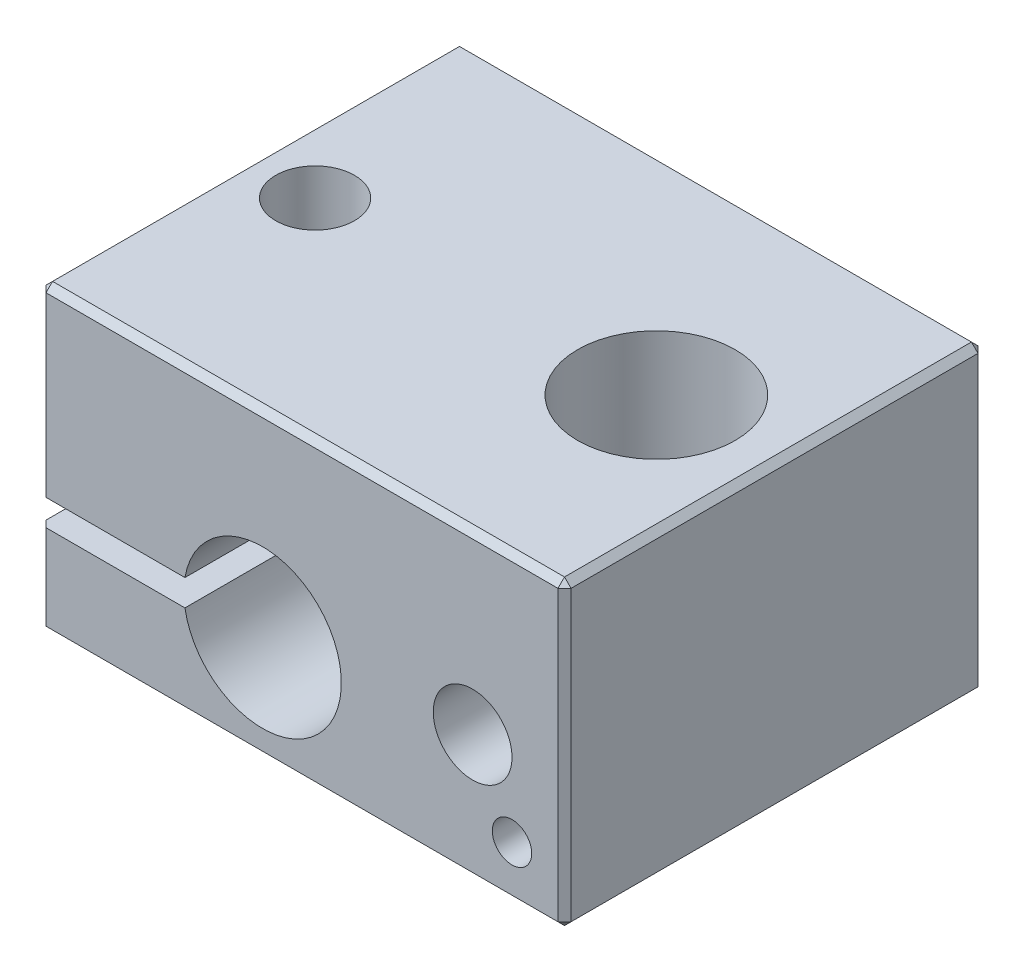
ISO-10303-21;
HEADER;
FILE_DESCRIPTION(('STEP AP214'),'2;1');
FILE_NAME('part.step','',(''),(''),'','','');
FILE_SCHEMA(('AUTOMOTIVE_DESIGN { 1 0 10303 214 1 1 1 1 }'));
ENDSEC;
DATA;
#1=APPLICATION_CONTEXT('core data for automotive mechanical design processes');
#2=APPLICATION_PROTOCOL_DEFINITION('international standard','automotive_design',2000,#1);
#3=PRODUCT_CONTEXT('',#1,'mechanical');
#4=PRODUCT('Part','Part','',(#3));
#5=PRODUCT_RELATED_PRODUCT_CATEGORY('part','',(#4));
#6=PRODUCT_DEFINITION_FORMATION('','',#4);
#7=PRODUCT_DEFINITION_CONTEXT('part definition',#1,'design');
#8=PRODUCT_DEFINITION('design','',#6,#7);
#9=PRODUCT_DEFINITION_SHAPE('','',#8);
#10=(LENGTH_UNIT() NAMED_UNIT(*) SI_UNIT(.MILLI.,.METRE.));
#11=(NAMED_UNIT(*) PLANE_ANGLE_UNIT() SI_UNIT($,.RADIAN.));
#12=(NAMED_UNIT(*) SI_UNIT($,.STERADIAN.) SOLID_ANGLE_UNIT());
#13=UNCERTAINTY_MEASURE_WITH_UNIT(LENGTH_MEASURE(1.E-05),#10,'distance_accuracy_value','');
#14=(GEOMETRIC_REPRESENTATION_CONTEXT(3) GLOBAL_UNCERTAINTY_ASSIGNED_CONTEXT((#13)) GLOBAL_UNIT_ASSIGNED_CONTEXT((#10,
#11,#12)) REPRESENTATION_CONTEXT('',''));
#15=CARTESIAN_POINT('',(0.,0.,0.));
#16=DIRECTION('',(0.,0.,1.));
#17=DIRECTION('',(1.,0.,0.));
#18=AXIS2_PLACEMENT_3D('',#15,#16,#17);
#19=CARTESIAN_POINT('',(-9.99999999999999,11.5,7.99999999999999));
#20=DIRECTION('',(-1.,0.,0.));
#21=DIRECTION('',(0.,0.,1.));
#22=AXIS2_PLACEMENT_3D('',#19,#20,#21);
#23=PLANE('',#22);
#24=DIRECTION('',(0.,0.,-1.));
#25=VECTOR('',#24,1.);
#26=CARTESIAN_POINT('',(-10.,3.5,7.99999999999999));
#27=LINE('',#26,#25);
#28=CARTESIAN_POINT('',(-10.,3.5,7.74999999999999));
#29=VERTEX_POINT('',#28);
#30=CARTESIAN_POINT('',(-10.,3.5,-7.75000000000001));
#31=VERTEX_POINT('',#30);
#32=EDGE_CURVE('E192',#29,#31,#27,.T.);
#33=ORIENTED_EDGE('',*,*,#32,.T.);
#34=DIRECTION('',(0.,-1.,0.));
#35=VECTOR('',#34,1.);
#36=CARTESIAN_POINT('',(-10.,11.5,-7.75000000000001));
#37=LINE('',#36,#35);
#38=CARTESIAN_POINT('',(-10.,0.250000000000004,-7.75000000000001));
#39=VERTEX_POINT('',#38);
#40=EDGE_CURVE('E208',#31,#39,#37,.T.);
#41=ORIENTED_EDGE('',*,*,#40,.T.);
#42=DIRECTION('',(0.,0.,1.));
#43=VECTOR('',#42,1.);
#44=CARTESIAN_POINT('',(-9.99999999999999,0.250000000000004,7.99999999999999));
#45=LINE('',#44,#43);
#46=CARTESIAN_POINT('',(-9.99999999999999,0.250000000000004,7.74999999999999));
#47=VERTEX_POINT('',#46);
#48=EDGE_CURVE('E206',#39,#47,#45,.T.);
#49=ORIENTED_EDGE('',*,*,#48,.T.);
#50=DIRECTION('',(0.,1.,0.));
#51=VECTOR('',#50,1.);
#52=CARTESIAN_POINT('',(-9.99999999999999,11.5,7.74999999999999));
#53=LINE('',#52,#51);
#54=EDGE_CURVE('E173',#47,#29,#53,.T.);
#55=ORIENTED_EDGE('',*,*,#54,.T.);
#56=EDGE_LOOP('',(#33,#41,#49,#55));
#57=FACE_BOUND('',#56,.T.);
#58=ADVANCED_FACE('F34',(#57),#23,.T.);
#59=CARTESIAN_POINT('',(-10.,11.5,-8.00000000000001));
#60=DIRECTION('',(0.,0.,-1.));
#61=DIRECTION('',(-1.,0.,0.));
#62=AXIS2_PLACEMENT_3D('',#59,#60,#61);
#63=PLANE('',#62);
#64=DIRECTION('',(-1.,0.,0.));
#65=VECTOR('',#64,1.);
#66=CARTESIAN_POINT('',(-10.,0.250000000000004,-8.00000000000001));
#67=LINE('',#66,#65);
#68=CARTESIAN_POINT('',(9.75,0.250000000000004,-8.00000000000001));
#69=VERTEX_POINT('',#68);
#70=CARTESIAN_POINT('',(-9.74999999999999,0.250000000000004,-8.00000000000001));
#71=VERTEX_POINT('',#70);
#72=EDGE_CURVE('E217',#69,#71,#67,.T.);
#73=ORIENTED_EDGE('',*,*,#72,.T.);
#74=DIRECTION('',(0.,1.,0.));
#75=VECTOR('',#74,1.);
#76=CARTESIAN_POINT('',(-9.74999999999999,11.5,-8.00000000000001));
#77=LINE('',#76,#75);
#78=CARTESIAN_POINT('',(-9.74999999999999,3.5,-8.00000000000001));
#79=VERTEX_POINT('',#78);
#80=EDGE_CURVE('E219',#71,#79,#77,.T.);
#81=ORIENTED_EDGE('',*,*,#80,.T.);
#82=DIRECTION('',(-1.,0.,0.));
#83=VECTOR('',#82,1.);
#84=CARTESIAN_POINT('',(-4.4580398915498,3.5,-8.00000000000001));
#85=LINE('',#84,#83);
#86=CARTESIAN_POINT('',(-4.4580398915498,3.5,-8.00000000000001));
#87=VERTEX_POINT('',#86);
#88=EDGE_CURVE('E194',#87,#79,#85,.T.);
#89=ORIENTED_EDGE('',*,*,#88,.F.);
#90=CARTESIAN_POINT('',(-1.49999999999999,4.,-8.00000000000001));
#91=DIRECTION('',(0.,0.,1.));
#92=DIRECTION('',(1.,0.,0.));
#93=AXIS2_PLACEMENT_3D('',#90,#91,#92);
#94=CIRCLE('',#93,3.);
#95=CARTESIAN_POINT('',(-4.4580398915498,4.5,-8.00000000000001));
#96=VERTEX_POINT('',#95);
#97=EDGE_CURVE('E168',#87,#96,#94,.T.);
#98=ORIENTED_EDGE('',*,*,#97,.T.);
#99=DIRECTION('',(1.,0.,0.));
#100=VECTOR('',#99,1.);
#101=CARTESIAN_POINT('',(-10.,4.5,-8.00000000000001));
#102=LINE('',#101,#100);
#103=CARTESIAN_POINT('',(-9.74999999999999,4.5,-8.00000000000001));
#104=VERTEX_POINT('',#103);
#105=EDGE_CURVE('E190',#104,#96,#102,.T.);
#106=ORIENTED_EDGE('',*,*,#105,.F.);
#107=DIRECTION('',(0.,1.,0.));
#108=VECTOR('',#107,1.);
#109=CARTESIAN_POINT('',(-9.74999999999999,11.5,-8.00000000000001));
#110=LINE('',#109,#108);
#111=CARTESIAN_POINT('',(-9.74999999999999,11.25,-8.00000000000001));
#112=VERTEX_POINT('',#111);
#113=EDGE_CURVE('E215',#104,#112,#110,.T.);
#114=ORIENTED_EDGE('',*,*,#113,.T.);
#115=DIRECTION('',(1.,0.,0.));
#116=VECTOR('',#115,1.);
#117=CARTESIAN_POINT('',(10.,11.25,-8.00000000000001));
#118=LINE('',#117,#116);
#119=CARTESIAN_POINT('',(9.75,11.25,-8.00000000000001));
#120=VERTEX_POINT('',#119);
#121=EDGE_CURVE('E211',#112,#120,#118,.T.);
#122=ORIENTED_EDGE('',*,*,#121,.T.);
#123=DIRECTION('',(0.,-1.,0.));
#124=VECTOR('',#123,1.);
#125=CARTESIAN_POINT('',(9.75,11.5,-8.00000000000001));
#126=LINE('',#125,#124);
#127=EDGE_CURVE('E213',#120,#69,#126,.T.);
#128=ORIENTED_EDGE('',*,*,#127,.T.);
#129=EDGE_LOOP('',(#73,#81,#89,#98,#106,#114,#122,#128));
#130=FACE_BOUND('',#129,.T.);
#131=ADVANCED_FACE('F394',(#130),#63,.T.);
#132=DIRECTION('',(0.,0.,-1.));
#133=VECTOR('',#132,1.);
#134=CARTESIAN_POINT('',(-10.,11.25,-8.00000000000001));
#135=LINE('',#134,#133);
#136=CARTESIAN_POINT('',(-9.99999999999999,11.25,7.74999999999999));
#137=VERTEX_POINT('',#136);
#138=CARTESIAN_POINT('',(-10.,11.25,-7.75000000000001));
#139=VERTEX_POINT('',#138);
#140=EDGE_CURVE('E254',#137,#139,#135,.T.);
#141=ORIENTED_EDGE('',*,*,#140,.T.);
#142=DIRECTION('',(0.,-1.,0.));
#143=VECTOR('',#142,1.);
#144=CARTESIAN_POINT('',(-10.,11.5,-7.75000000000001));
#145=LINE('',#144,#143);
#146=CARTESIAN_POINT('',(-10.,4.5,-7.75000000000001));
#147=VERTEX_POINT('',#146);
#148=EDGE_CURVE('E256',#139,#147,#145,.T.);
#149=ORIENTED_EDGE('',*,*,#148,.T.);
#150=DIRECTION('',(0.,0.,-1.));
#151=VECTOR('',#150,1.);
#152=CARTESIAN_POINT('',(-10.,4.5,7.99999999999999));
#153=LINE('',#152,#151);
#154=CARTESIAN_POINT('',(-10.,4.5,7.74999999999999));
#155=VERTEX_POINT('',#154);
#156=EDGE_CURVE('E200',#155,#147,#153,.T.);
#157=ORIENTED_EDGE('',*,*,#156,.F.);
#158=DIRECTION('',(0.,1.,0.));
#159=VECTOR('',#158,1.);
#160=CARTESIAN_POINT('',(-9.99999999999999,11.5,7.74999999999999));
#161=LINE('',#160,#159);
#162=EDGE_CURVE('E252',#155,#137,#161,.T.);
#163=ORIENTED_EDGE('',*,*,#162,.T.);
#164=EDGE_LOOP('',(#141,#149,#157,#163));
#165=FACE_BOUND('',#164,.T.);
#166=ADVANCED_FACE('F399',(#165),#23,.T.);
#167=CARTESIAN_POINT('',(10.,11.5,7.99999999999999));
#168=DIRECTION('',(0.,0.,1.));
#169=DIRECTION('',(1.,0.,0.));
#170=AXIS2_PLACEMENT_3D('',#167,#168,#169);
#171=PLANE('',#170);
#172=DIRECTION('',(-1.,0.,0.));
#173=VECTOR('',#172,1.);
#174=CARTESIAN_POINT('',(-4.4580398915498,3.5,7.99999999999999));
#175=LINE('',#174,#173);
#176=CARTESIAN_POINT('',(-4.4580398915498,3.5,7.99999999999999));
#177=VERTEX_POINT('',#176);
#178=CARTESIAN_POINT('',(-9.74999999999999,3.5,7.99999999999999));
#179=VERTEX_POINT('',#178);
#180=EDGE_CURVE('E180',#177,#179,#175,.T.);
#181=ORIENTED_EDGE('',*,*,#180,.T.);
#182=DIRECTION('',(0.,-1.,0.));
#183=VECTOR('',#182,1.);
#184=CARTESIAN_POINT('',(-9.75,11.5,7.99999999999999));
#185=LINE('',#184,#183);
#186=CARTESIAN_POINT('',(-9.75,0.250000000000004,7.99999999999999));
#187=VERTEX_POINT('',#186);
#188=EDGE_CURVE('E241',#179,#187,#185,.T.);
#189=ORIENTED_EDGE('',*,*,#188,.T.);
#190=DIRECTION('',(1.,0.,0.));
#191=VECTOR('',#190,1.);
#192=CARTESIAN_POINT('',(10.,0.250000000000004,7.99999999999999));
#193=LINE('',#192,#191);
#194=CARTESIAN_POINT('',(9.75,0.250000000000004,7.99999999999999));
#195=VERTEX_POINT('',#194);
#196=EDGE_CURVE('E239',#187,#195,#193,.T.);
#197=ORIENTED_EDGE('',*,*,#196,.T.);
#198=DIRECTION('',(0.,1.,0.));
#199=VECTOR('',#198,1.);
#200=CARTESIAN_POINT('',(9.75,11.5,7.99999999999999));
#201=LINE('',#200,#199);
#202=CARTESIAN_POINT('',(9.75,11.25,7.99999999999999));
#203=VERTEX_POINT('',#202);
#204=EDGE_CURVE('E235',#195,#203,#201,.T.);
#205=ORIENTED_EDGE('',*,*,#204,.T.);
#206=DIRECTION('',(-1.,0.,0.));
#207=VECTOR('',#206,1.);
#208=CARTESIAN_POINT('',(-9.99999999999999,11.25,7.99999999999999));
#209=LINE('',#208,#207);
#210=CARTESIAN_POINT('',(-9.75,11.25,7.99999999999999));
#211=VERTEX_POINT('',#210);
#212=EDGE_CURVE('E233',#203,#211,#209,.T.);
#213=ORIENTED_EDGE('',*,*,#212,.T.);
#214=DIRECTION('',(0.,-1.,0.));
#215=VECTOR('',#214,1.);
#216=CARTESIAN_POINT('',(-9.75,11.5,7.99999999999999));
#217=LINE('',#216,#215);
#218=CARTESIAN_POINT('',(-9.75,4.5,7.99999999999999));
#219=VERTEX_POINT('',#218);
#220=EDGE_CURVE('E237',#211,#219,#217,.T.);
#221=ORIENTED_EDGE('',*,*,#220,.T.);
#222=DIRECTION('',(1.,0.,0.));
#223=VECTOR('',#222,1.);
#224=CARTESIAN_POINT('',(-10.,4.5,7.99999999999999));
#225=LINE('',#224,#223);
#226=CARTESIAN_POINT('',(-4.4580398915498,4.5,7.99999999999999));
#227=VERTEX_POINT('',#226);
#228=EDGE_CURVE('E183',#219,#227,#225,.T.);
#229=ORIENTED_EDGE('',*,*,#228,.T.);
#230=CARTESIAN_POINT('',(-1.49999999999999,4.,7.99999999999999));
#231=DIRECTION('',(0.,0.,1.));
#232=DIRECTION('',(1.,0.,0.));
#233=AXIS2_PLACEMENT_3D('',#230,#231,#232);
#234=CIRCLE('',#233,3.);
#235=EDGE_CURVE('E165',#177,#227,#234,.T.);
#236=ORIENTED_EDGE('',*,*,#235,.F.);
#237=EDGE_LOOP('',(#181,#189,#197,#205,#213,#221,#229,#236));
#238=FACE_BOUND('',#237,.T.);
#239=CARTESIAN_POINT('',(8.00000000000001,2.,7.99999999999999));
#240=DIRECTION('',(0.,0.,1.));
#241=DIRECTION('',(1.,0.,0.));
#242=AXIS2_PLACEMENT_3D('',#239,#240,#241);
#243=CIRCLE('',#242,0.74999999999999);
#244=CARTESIAN_POINT('',(8.75,2.,7.99999999999999));
#245=VERTEX_POINT('',#244);
#246=EDGE_CURVE('E331',#245,#245,#243,.T.);
#247=ORIENTED_EDGE('',*,*,#246,.F.);
#248=EDGE_LOOP('',(#247));
#249=FACE_BOUND('',#248,.T.);
#250=CARTESIAN_POINT('',(6.50000000000001,4.8,7.99999999999999));
#251=DIRECTION('',(0.,0.,1.));
#252=DIRECTION('',(1.,0.,0.));
#253=AXIS2_PLACEMENT_3D('',#250,#251,#252);
#254=CIRCLE('',#253,1.49999999999999);
#255=CARTESIAN_POINT('',(8.,4.8,7.99999999999999));
#256=VERTEX_POINT('',#255);
#257=EDGE_CURVE('E341',#256,#256,#254,.T.);
#258=ORIENTED_EDGE('',*,*,#257,.F.);
#259=EDGE_LOOP('',(#258));
#260=FACE_BOUND('',#259,.T.);
#261=ADVANCED_FACE('F178',(#238,#249,#260),#171,.T.);
#262=CARTESIAN_POINT('',(10.,11.5,-8.00000000000001));
#263=DIRECTION('',(1.,0.,0.));
#264=DIRECTION('',(0.,0.,-1.));
#265=AXIS2_PLACEMENT_3D('',#262,#263,#264);
#266=PLANE('',#265);
#267=DIRECTION('',(0.,-1.,0.));
#268=VECTOR('',#267,1.);
#269=CARTESIAN_POINT('',(10.,11.5,7.75));
#270=LINE('',#269,#268);
#271=CARTESIAN_POINT('',(10.,11.25,7.75));
#272=VERTEX_POINT('',#271);
#273=CARTESIAN_POINT('',(10.,0.249999999999997,7.75));
#274=VERTEX_POINT('',#273);
#275=EDGE_CURVE('E245',#272,#274,#270,.T.);
#276=ORIENTED_EDGE('',*,*,#275,.T.);
#277=DIRECTION('',(0.,0.,-1.));
#278=VECTOR('',#277,1.);
#279=CARTESIAN_POINT('',(10.,0.249999999999997,-8.00000000000001));
#280=LINE('',#279,#278);
#281=CARTESIAN_POINT('',(10.,0.249999999999997,-7.75000000000001));
#282=VERTEX_POINT('',#281);
#283=EDGE_CURVE('E249',#274,#282,#280,.T.);
#284=ORIENTED_EDGE('',*,*,#283,.T.);
#285=DIRECTION('',(0.,1.,0.));
#286=VECTOR('',#285,1.);
#287=CARTESIAN_POINT('',(10.,11.5,-7.75000000000001));
#288=LINE('',#287,#286);
#289=CARTESIAN_POINT('',(10.,11.25,-7.75000000000001));
#290=VERTEX_POINT('',#289);
#291=EDGE_CURVE('E247',#282,#290,#288,.T.);
#292=ORIENTED_EDGE('',*,*,#291,.T.);
#293=DIRECTION('',(0.,0.,1.));
#294=VECTOR('',#293,1.);
#295=CARTESIAN_POINT('',(10.,11.25,7.99999999999999));
#296=LINE('',#295,#294);
#297=EDGE_CURVE('E243',#290,#272,#296,.T.);
#298=ORIENTED_EDGE('',*,*,#297,.T.);
#299=EDGE_LOOP('',(#276,#284,#292,#298));
#300=FACE_BOUND('',#299,.T.);
#301=ADVANCED_FACE('F468',(#300),#266,.T.);
#302=CARTESIAN_POINT('',(0.,11.5,0.));
#303=DIRECTION('',(0.,-1.,0.));
#304=DIRECTION('',(0.,0.,-1.));
#305=AXIS2_PLACEMENT_3D('',#302,#303,#304);
#306=PLANE('',#305);
#307=DIRECTION('',(-1.,0.,0.));
#308=VECTOR('',#307,1.);
#309=CARTESIAN_POINT('',(-10.,11.5,-7.75));
#310=LINE('',#309,#308);
#311=CARTESIAN_POINT('',(9.75,11.5,-7.75));
#312=VERTEX_POINT('',#311);
#313=CARTESIAN_POINT('',(-9.74999999999999,11.5,-7.75));
#314=VERTEX_POINT('',#313);
#315=EDGE_CURVE('E43',#312,#314,#310,.T.);
#316=ORIENTED_EDGE('',*,*,#315,.T.);
#317=DIRECTION('',(0.,0.,1.));
#318=VECTOR('',#317,1.);
#319=CARTESIAN_POINT('',(-9.74999999999999,11.5,7.99999999999999));
#320=LINE('',#319,#318);
#321=CARTESIAN_POINT('',(-9.74999999999999,11.5,7.74999999999999));
#322=VERTEX_POINT('',#321);
#323=EDGE_CURVE('E11',#314,#322,#320,.T.);
#324=ORIENTED_EDGE('',*,*,#323,.T.);
#325=DIRECTION('',(1.,0.,0.));
#326=VECTOR('',#325,1.);
#327=CARTESIAN_POINT('',(10.,11.5,7.74999999999999));
#328=LINE('',#327,#326);
#329=CARTESIAN_POINT('',(9.75,11.5,7.74999999999999));
#330=VERTEX_POINT('',#329);
#331=EDGE_CURVE('E57',#322,#330,#328,.T.);
#332=ORIENTED_EDGE('',*,*,#331,.T.);
#333=DIRECTION('',(0.,0.,-1.));
#334=VECTOR('',#333,1.);
#335=CARTESIAN_POINT('',(9.75,11.5,-8.00000000000001));
#336=LINE('',#335,#334);
#337=EDGE_CURVE('E262',#330,#312,#336,.T.);
#338=ORIENTED_EDGE('',*,*,#337,.T.);
#339=EDGE_LOOP('',(#316,#324,#332,#338));
#340=FACE_BOUND('',#339,.T.);
#341=CARTESIAN_POINT('',(5.50000000000001,11.5,0.));
#342=DIRECTION('',(0.,-1.,0.));
#343=DIRECTION('',(0.,0.,-1.));
#344=AXIS2_PLACEMENT_3D('',#341,#342,#343);
#345=CIRCLE('',#344,2.99999999999999);
#346=CARTESIAN_POINT('',(5.50000000000001,11.5,-2.99999999999999));
#347=VERTEX_POINT('',#346);
#348=EDGE_CURVE('E358',#347,#347,#345,.T.);
#349=ORIENTED_EDGE('',*,*,#348,.T.);
#350=EDGE_LOOP('',(#349));
#351=FACE_BOUND('',#350,.T.);
#352=CARTESIAN_POINT('',(-7.49999999999999,11.5,0.));
#353=DIRECTION('',(0.,-1.,0.));
#354=DIRECTION('',(0.,0.,-1.));
#355=AXIS2_PLACEMENT_3D('',#352,#353,#354);
#356=CIRCLE('',#355,1.49999999999999);
#357=CARTESIAN_POINT('',(-7.49999999999999,11.5,-1.49999999999999));
#358=VERTEX_POINT('',#357);
#359=EDGE_CURVE('E184',#358,#358,#356,.T.);
#360=ORIENTED_EDGE('',*,*,#359,.T.);
#361=EDGE_LOOP('',(#360));
#362=FACE_BOUND('',#361,.T.);
#363=ADVANCED_FACE('F367',(#340,#351,#362),#306,.F.);
#364=CARTESIAN_POINT('',(0.,0.,0.));
#365=DIRECTION('',(0.,-1.,0.));
#366=DIRECTION('',(0.,0.,-1.));
#367=AXIS2_PLACEMENT_3D('',#364,#365,#366);
#368=PLANE('',#367);
#369=DIRECTION('',(-1.,0.,0.));
#370=VECTOR('',#369,1.);
#371=CARTESIAN_POINT('',(0.,0.,7.75));
#372=LINE('',#371,#370);
#373=CARTESIAN_POINT('',(9.75,0.,7.75));
#374=VERTEX_POINT('',#373);
#375=CARTESIAN_POINT('',(-9.75,0.,7.75));
#376=VERTEX_POINT('',#375);
#377=EDGE_CURVE('E226',#374,#376,#372,.T.);
#378=ORIENTED_EDGE('',*,*,#377,.T.);
#379=DIRECTION('',(0.,0.,-1.));
#380=VECTOR('',#379,1.);
#381=CARTESIAN_POINT('',(-9.75,0.,0.));
#382=LINE('',#381,#380);
#383=CARTESIAN_POINT('',(-9.75,0.,-7.75000000000001));
#384=VERTEX_POINT('',#383);
#385=EDGE_CURVE('E230',#376,#384,#382,.T.);
#386=ORIENTED_EDGE('',*,*,#385,.T.);
#387=DIRECTION('',(1.,0.,0.));
#388=VECTOR('',#387,1.);
#389=CARTESIAN_POINT('',(0.,0.,-7.75000000000001));
#390=LINE('',#389,#388);
#391=CARTESIAN_POINT('',(9.75,0.,-7.75000000000001));
#392=VERTEX_POINT('',#391);
#393=EDGE_CURVE('E228',#384,#392,#390,.T.);
#394=ORIENTED_EDGE('',*,*,#393,.T.);
#395=DIRECTION('',(0.,0.,1.));
#396=VECTOR('',#395,1.);
#397=CARTESIAN_POINT('',(9.75,0.,0.));
#398=LINE('',#397,#396);
#399=EDGE_CURVE('E224',#392,#374,#398,.T.);
#400=ORIENTED_EDGE('',*,*,#399,.T.);
#401=EDGE_LOOP('',(#378,#386,#394,#400));
#402=FACE_BOUND('',#401,.T.);
#403=CARTESIAN_POINT('',(-7.49999999999999,0.,0.));
#404=DIRECTION('',(0.,1.,0.));
#405=DIRECTION('',(0.,0.,1.));
#406=AXIS2_PLACEMENT_3D('',#403,#404,#405);
#407=CIRCLE('',#406,1.49999999999999);
#408=CARTESIAN_POINT('',(-7.49999999999999,0.,1.49999999999998));
#409=VERTEX_POINT('',#408);
#410=EDGE_CURVE('E352',#409,#409,#407,.T.);
#411=ORIENTED_EDGE('',*,*,#410,.T.);
#412=EDGE_LOOP('',(#411));
#413=FACE_BOUND('',#412,.T.);
#414=CARTESIAN_POINT('',(5.50000000000001,0.,0.));
#415=DIRECTION('',(0.,-1.,0.));
#416=DIRECTION('',(0.,0.,-1.));
#417=AXIS2_PLACEMENT_3D('',#414,#415,#416);
#418=CIRCLE('',#417,2.99999999999999);
#419=CARTESIAN_POINT('',(5.50000000000001,0.,-3.));
#420=VERTEX_POINT('',#419);
#421=EDGE_CURVE('E355',#420,#420,#418,.T.);
#422=ORIENTED_EDGE('',*,*,#421,.F.);
#423=EDGE_LOOP('',(#422));
#424=FACE_BOUND('',#423,.T.);
#425=ADVANCED_FACE('F467',(#402,#413,#424),#368,.T.);
#426=CARTESIAN_POINT('',(-4.4580398915498,3.5,7.99999999999999));
#427=DIRECTION('',(0.,-1.,0.));
#428=DIRECTION('',(1.,0.,0.));
#429=AXIS2_PLACEMENT_3D('',#426,#427,#428);
#430=PLANE('',#429);
#431=CARTESIAN_POINT('',(-7.49999999999999,3.5,0.));
#432=DIRECTION('',(0.,1.,0.));
#433=DIRECTION('',(0.,0.,1.));
#434=AXIS2_PLACEMENT_3D('',#431,#432,#433);
#435=CIRCLE('',#434,1.49999999999999);
#436=CARTESIAN_POINT('',(-7.49999999999999,3.5,1.49999999999998));
#437=VERTEX_POINT('',#436);
#438=EDGE_CURVE('E349',#437,#437,#435,.T.);
#439=ORIENTED_EDGE('',*,*,#438,.F.);
#440=EDGE_LOOP('',(#439));
#441=FACE_BOUND('',#440,.T.);
#442=ORIENTED_EDGE('',*,*,#88,.T.);
#443=DIRECTION('',(0.707106781186557,0.,-0.707106781186538));
#444=VECTOR('',#443,1.);
#445=CARTESIAN_POINT('',(-10.,3.5,-7.75000000000001));
#446=LINE('',#445,#444);
#447=EDGE_CURVE('E222',#79,#31,#446,.F.);
#448=ORIENTED_EDGE('',*,*,#447,.T.);
#449=ORIENTED_EDGE('',*,*,#32,.F.);
#450=DIRECTION('',(-0.70710678118654,0.,-0.707106781186555));
#451=VECTOR('',#450,1.);
#452=CARTESIAN_POINT('',(-9.75,3.5,7.99999999999999));
#453=LINE('',#452,#451);
#454=EDGE_CURVE('E189',#29,#179,#453,.F.);
#455=ORIENTED_EDGE('',*,*,#454,.T.);
#456=ORIENTED_EDGE('',*,*,#180,.F.);
#457=DIRECTION('',(0.,0.,-1.));
#458=VECTOR('',#457,1.);
#459=CARTESIAN_POINT('',(-4.4580398915498,3.5,7.99999999999999));
#460=LINE('',#459,#458);
#461=EDGE_CURVE('E161',#177,#87,#460,.T.);
#462=ORIENTED_EDGE('',*,*,#461,.T.);
#463=EDGE_LOOP('',(#442,#448,#449,#455,#456,#462));
#464=FACE_BOUND('',#463,.T.);
#465=ADVANCED_FACE('F186',(#441,#464),#430,.F.);
#466=CARTESIAN_POINT('',(-10.,4.5,7.99999999999999));
#467=DIRECTION('',(0.,1.,0.));
#468=DIRECTION('',(0.,0.,1.));
#469=AXIS2_PLACEMENT_3D('',#466,#467,#468);
#470=PLANE('',#469);
#471=CARTESIAN_POINT('',(-7.49999999999999,4.5,0.));
#472=DIRECTION('',(0.,-1.,0.));
#473=DIRECTION('',(0.,0.,-1.));
#474=AXIS2_PLACEMENT_3D('',#471,#472,#473);
#475=CIRCLE('',#474,1.49999999999999);
#476=CARTESIAN_POINT('',(-7.49999999999999,4.5,-1.49999999999999));
#477=VERTEX_POINT('',#476);
#478=EDGE_CURVE('E361',#477,#477,#475,.T.);
#479=ORIENTED_EDGE('',*,*,#478,.F.);
#480=EDGE_LOOP('',(#479));
#481=FACE_BOUND('',#480,.T.);
#482=ORIENTED_EDGE('',*,*,#156,.T.);
#483=DIRECTION('',(-0.707106781186557,0.,0.707106781186538));
#484=VECTOR('',#483,1.);
#485=CARTESIAN_POINT('',(-10.,4.5,-7.75000000000001));
#486=LINE('',#485,#484);
#487=EDGE_CURVE('E260',#147,#104,#486,.F.);
#488=ORIENTED_EDGE('',*,*,#487,.T.);
#489=ORIENTED_EDGE('',*,*,#105,.T.);
#490=DIRECTION('',(0.,0.,-1.));
#491=VECTOR('',#490,1.);
#492=CARTESIAN_POINT('',(-4.4580398915498,4.5,7.99999999999999));
#493=LINE('',#492,#491);
#494=EDGE_CURVE('E174',#227,#96,#493,.T.);
#495=ORIENTED_EDGE('',*,*,#494,.F.);
#496=ORIENTED_EDGE('',*,*,#228,.F.);
#497=DIRECTION('',(0.70710678118654,0.,0.707106781186555));
#498=VECTOR('',#497,1.);
#499=CARTESIAN_POINT('',(-9.75,4.5,7.99999999999999));
#500=LINE('',#499,#498);
#501=EDGE_CURVE('E258',#219,#155,#500,.F.);
#502=ORIENTED_EDGE('',*,*,#501,.T.);
#503=EDGE_LOOP('',(#482,#488,#489,#495,#496,#502));
#504=FACE_BOUND('',#503,.T.);
#505=ADVANCED_FACE('F376',(#481,#504),#470,.F.);
#506=CARTESIAN_POINT('',(-1.49999999999999,4.,-8.00000000000001));
#507=DIRECTION('',(0.,0.,1.));
#508=DIRECTION('',(1.,0.,0.));
#509=AXIS2_PLACEMENT_3D('',#506,#507,#508);
#510=CYLINDRICAL_SURFACE('',#509,3.);
#511=ORIENTED_EDGE('',*,*,#235,.T.);
#512=ORIENTED_EDGE('',*,*,#494,.T.);
#513=ORIENTED_EDGE('',*,*,#97,.F.);
#514=ORIENTED_EDGE('',*,*,#461,.F.);
#515=EDGE_LOOP('',(#511,#512,#513,#514));
#516=FACE_BOUND('',#515,.T.);
#517=ADVANCED_FACE('F163',(#516),#510,.F.);
#518=CARTESIAN_POINT('',(-7.49999999999999,4.5,0.));
#519=DIRECTION('',(0.,-1.,0.));
#520=DIRECTION('',(0.,0.,-1.));
#521=AXIS2_PLACEMENT_3D('',#518,#519,#520);
#522=CYLINDRICAL_SURFACE('',#521,1.49999999999999);
#523=ORIENTED_EDGE('',*,*,#359,.F.);
#524=EDGE_LOOP('',(#523));
#525=FACE_BOUND('',#524,.T.);
#526=ORIENTED_EDGE('',*,*,#478,.T.);
#527=EDGE_LOOP('',(#526));
#528=FACE_BOUND('',#527,.T.);
#529=ADVANCED_FACE('F369',(#525,#528),#522,.F.);
#530=CARTESIAN_POINT('',(5.50000000000001,0.,0.));
#531=DIRECTION('',(0.,-1.,0.));
#532=DIRECTION('',(0.,0.,-1.));
#533=AXIS2_PLACEMENT_3D('',#530,#531,#532);
#534=CYLINDRICAL_SURFACE('',#533,2.99999999999999);
#535=ORIENTED_EDGE('',*,*,#348,.F.);
#536=EDGE_LOOP('',(#535));
#537=FACE_BOUND('',#536,.T.);
#538=ORIENTED_EDGE('',*,*,#421,.T.);
#539=EDGE_LOOP('',(#538));
#540=FACE_BOUND('',#539,.T.);
#541=ADVANCED_FACE('F372',(#537,#540),#534,.F.);
#542=CARTESIAN_POINT('',(-7.49999999999999,3.5,0.));
#543=DIRECTION('',(0.,1.,0.));
#544=DIRECTION('',(0.,0.,1.));
#545=AXIS2_PLACEMENT_3D('',#542,#543,#544);
#546=CYLINDRICAL_SURFACE('',#545,1.49999999999999);
#547=ORIENTED_EDGE('',*,*,#410,.F.);
#548=EDGE_LOOP('',(#547));
#549=FACE_BOUND('',#548,.T.);
#550=ORIENTED_EDGE('',*,*,#438,.T.);
#551=EDGE_LOOP('',(#550));
#552=FACE_BOUND('',#551,.T.);
#553=ADVANCED_FACE('F474',(#549,#552),#546,.F.);
#554=CARTESIAN_POINT('',(6.50000000000001,4.8,4.49999999999999));
#555=DIRECTION('',(0.,0.,-1.));
#556=DIRECTION('',(-1.,0.,0.));
#557=AXIS2_PLACEMENT_3D('',#554,#555,#556);
#558=PLANE('',#557);
#559=CARTESIAN_POINT('',(6.50000000000001,4.8,4.49999999999999));
#560=DIRECTION('',(0.,0.,1.));
#561=DIRECTION('',(1.,0.,0.));
#562=AXIS2_PLACEMENT_3D('',#559,#560,#561);
#563=CIRCLE('',#562,1.49999999999999);
#564=CARTESIAN_POINT('',(7.99999999999999,4.8,4.49999999999999));
#565=VERTEX_POINT('',#564);
#566=EDGE_CURVE('E346',#565,#565,#563,.T.);
#567=ORIENTED_EDGE('',*,*,#566,.T.);
#568=EDGE_LOOP('',(#567));
#569=FACE_BOUND('',#568,.T.);
#570=ADVANCED_FACE('F571',(#569),#558,.F.);
#571=CARTESIAN_POINT('',(6.50000000000001,4.8,7.99999999999999));
#572=DIRECTION('',(0.,0.,1.));
#573=DIRECTION('',(1.,0.,0.));
#574=AXIS2_PLACEMENT_3D('',#571,#572,#573);
#575=CYLINDRICAL_SURFACE('',#574,1.49999999999999);
#576=ORIENTED_EDGE('',*,*,#566,.F.);
#577=EDGE_LOOP('',(#576));
#578=FACE_BOUND('',#577,.T.);
#579=ORIENTED_EDGE('',*,*,#257,.T.);
#580=EDGE_LOOP('',(#579));
#581=FACE_BOUND('',#580,.T.);
#582=ADVANCED_FACE('F564',(#578,#581),#575,.F.);
#583=CARTESIAN_POINT('',(8.00000000000001,2.,3.49999999999999));
#584=DIRECTION('',(0.,0.,-1.));
#585=DIRECTION('',(-1.,0.,0.));
#586=AXIS2_PLACEMENT_3D('',#583,#584,#585);
#587=PLANE('',#586);
#588=CARTESIAN_POINT('',(8.00000000000001,2.,3.49999999999999));
#589=DIRECTION('',(0.,0.,1.));
#590=DIRECTION('',(1.,0.,0.));
#591=AXIS2_PLACEMENT_3D('',#588,#589,#590);
#592=CIRCLE('',#591,0.749999999999989);
#593=CARTESIAN_POINT('',(8.75,2.,3.49999999999999));
#594=VERTEX_POINT('',#593);
#595=EDGE_CURVE('E336',#594,#594,#592,.T.);
#596=ORIENTED_EDGE('',*,*,#595,.T.);
#597=EDGE_LOOP('',(#596));
#598=FACE_BOUND('',#597,.T.);
#599=ADVANCED_FACE('F558',(#598),#587,.F.);
#600=CARTESIAN_POINT('',(8.00000000000001,2.,7.99999999999999));
#601=DIRECTION('',(0.,0.,1.));
#602=DIRECTION('',(1.,0.,0.));
#603=AXIS2_PLACEMENT_3D('',#600,#601,#602);
#604=CYLINDRICAL_SURFACE('',#603,0.749999999999989);
#605=ORIENTED_EDGE('',*,*,#595,.F.);
#606=EDGE_LOOP('',(#605));
#607=FACE_BOUND('',#606,.T.);
#608=ORIENTED_EDGE('',*,*,#246,.T.);
#609=EDGE_LOOP('',(#608));
#610=FACE_BOUND('',#609,.T.);
#611=ADVANCED_FACE('F554',(#607,#610),#604,.F.);
#612=CARTESIAN_POINT('',(-9.75,11.5,7.99999999999999));
#613=DIRECTION('',(0.707106781186555,0.,-0.70710678118654));
#614=DIRECTION('',(0.,-1.,0.));
#615=AXIS2_PLACEMENT_3D('',#612,#613,#614);
#616=PLANE('',#615);
#617=DIRECTION('',(-0.70710678118654,0.,-0.707106781186555));
#618=VECTOR('',#617,1.);
#619=CARTESIAN_POINT('',(-9.87499999999999,11.25,7.87499999999999));
#620=LINE('',#619,#618);
#621=EDGE_CURVE('E38',#137,#211,#620,.F.);
#622=ORIENTED_EDGE('',*,*,#621,.F.);
#623=ORIENTED_EDGE('',*,*,#162,.F.);
#624=ORIENTED_EDGE('',*,*,#501,.F.);
#625=ORIENTED_EDGE('',*,*,#220,.F.);
#626=EDGE_LOOP('',(#622,#623,#624,#625));
#627=FACE_BOUND('',#626,.T.);
#628=ADVANCED_FACE('F36',(#627),#616,.F.);
#629=CARTESIAN_POINT('',(-9.74999999999999,11.5,7.74999999999999));
#630=DIRECTION('',(-0.577350269189623,0.577350269189643,0.577350269189611));
#631=DIRECTION('',(-0.70710678118656,-0.707106781186535,0.));
#632=AXIS2_PLACEMENT_3D('',#629,#630,#631);
#633=PLANE('',#632);
#634=DIRECTION('',(-0.707106781186559,-0.707106781186536,0.));
#635=VECTOR('',#634,1.);
#636=CARTESIAN_POINT('',(-9.74999999999999,11.5,7.74999999999999));
#637=LINE('',#636,#635);
#638=EDGE_CURVE('E326',#137,#322,#637,.F.);
#639=ORIENTED_EDGE('',*,*,#638,.F.);
#640=ORIENTED_EDGE('',*,*,#621,.T.);
#641=DIRECTION('',(0.,0.707106781186538,-0.707106781186557));
#642=VECTOR('',#641,1.);
#643=CARTESIAN_POINT('',(-9.74999999999999,11.5,7.74999999999999));
#644=LINE('',#643,#642);
#645=EDGE_CURVE('E328',#322,#211,#644,.F.);
#646=ORIENTED_EDGE('',*,*,#645,.F.);
#647=EDGE_LOOP('',(#639,#640,#646));
#648=FACE_BOUND('',#647,.T.);
#649=ADVANCED_FACE('F549',(#648),#633,.T.);
#650=CARTESIAN_POINT('',(10.,11.25,7.99999999999999));
#651=DIRECTION('',(0.,0.707106781186557,0.707106781186538));
#652=DIRECTION('',(1.,0.,0.));
#653=AXIS2_PLACEMENT_3D('',#650,#651,#652);
#654=PLANE('',#653);
#655=ORIENTED_EDGE('',*,*,#645,.T.);
#656=ORIENTED_EDGE('',*,*,#212,.F.);
#657=DIRECTION('',(0.,-0.707106781186538,0.707106781186557));
#658=VECTOR('',#657,1.);
#659=CARTESIAN_POINT('',(9.75,11.25,7.99999999999999));
#660=LINE('',#659,#658);
#661=EDGE_CURVE('E323',#330,#203,#660,.T.);
#662=ORIENTED_EDGE('',*,*,#661,.F.);
#663=ORIENTED_EDGE('',*,*,#331,.F.);
#664=EDGE_LOOP('',(#655,#656,#662,#663));
#665=FACE_BOUND('',#664,.T.);
#666=ADVANCED_FACE('F457',(#665),#654,.T.);
#667=CARTESIAN_POINT('',(-9.99999999999999,11.25,7.99999999999999));
#668=DIRECTION('',(-0.707106781186537,0.707106781186559,0.));
#669=DIRECTION('',(0.,0.,1.));
#670=AXIS2_PLACEMENT_3D('',#667,#668,#669);
#671=PLANE('',#670);
#672=ORIENTED_EDGE('',*,*,#638,.T.);
#673=ORIENTED_EDGE('',*,*,#323,.F.);
#674=DIRECTION('',(0.707106781186558,0.707106781186537,0.));
#675=VECTOR('',#674,1.);
#676=CARTESIAN_POINT('',(-9.87499999999999,11.375,-7.75000000000001));
#677=LINE('',#676,#675);
#678=EDGE_CURVE('E320',#139,#314,#677,.T.);
#679=ORIENTED_EDGE('',*,*,#678,.F.);
#680=ORIENTED_EDGE('',*,*,#140,.F.);
#681=EDGE_LOOP('',(#672,#673,#679,#680));
#682=FACE_BOUND('',#681,.T.);
#683=ADVANCED_FACE('F402',(#682),#671,.T.);
#684=CARTESIAN_POINT('',(-10.,11.5,-7.75000000000001));
#685=DIRECTION('',(0.707106781186538,0.,0.707106781186557));
#686=DIRECTION('',(0.,-1.,0.));
#687=AXIS2_PLACEMENT_3D('',#684,#685,#686);
#688=PLANE('',#687);
#689=ORIENTED_EDGE('',*,*,#487,.F.);
#690=ORIENTED_EDGE('',*,*,#148,.F.);
#691=DIRECTION('',(0.707106781186557,0.,-0.707106781186538));
#692=VECTOR('',#691,1.);
#693=CARTESIAN_POINT('',(-9.74999999999999,11.25,-8.00000000000001));
#694=LINE('',#693,#692);
#695=EDGE_CURVE('E317',#112,#139,#694,.F.);
#696=ORIENTED_EDGE('',*,*,#695,.F.);
#697=ORIENTED_EDGE('',*,*,#113,.F.);
#698=EDGE_LOOP('',(#689,#690,#696,#697));
#699=FACE_BOUND('',#698,.T.);
#700=ADVANCED_FACE('F389',(#699),#688,.F.);
#701=CARTESIAN_POINT('',(9.75,11.25,7.99999999999999));
#702=DIRECTION('',(0.57735026918961,0.577350269189642,0.577350269189626));
#703=DIRECTION('',(0.,-0.707106781186538,0.707106781186557));
#704=AXIS2_PLACEMENT_3D('',#701,#702,#703);
#705=PLANE('',#704);
#706=DIRECTION('',(-0.707106781186557,0.707106781186538,0.));
#707=VECTOR('',#706,1.);
#708=CARTESIAN_POINT('',(9.87500000000001,11.375,7.74999999999999));
#709=LINE('',#708,#707);
#710=EDGE_CURVE('E311',#330,#272,#709,.F.);
#711=ORIENTED_EDGE('',*,*,#710,.F.);
#712=ORIENTED_EDGE('',*,*,#661,.T.);
#713=DIRECTION('',(-0.707106781186557,0.,0.707106781186538));
#714=VECTOR('',#713,1.);
#715=CARTESIAN_POINT('',(9.75,11.25,7.99999999999999));
#716=LINE('',#715,#714);
#717=EDGE_CURVE('E314',#272,#203,#716,.T.);
#718=ORIENTED_EDGE('',*,*,#717,.F.);
#719=EDGE_LOOP('',(#711,#712,#718));
#720=FACE_BOUND('',#719,.T.);
#721=ADVANCED_FACE('F460',(#720),#705,.T.);
#722=CARTESIAN_POINT('',(-9.74999999999999,11.25,-8.00000000000001));
#723=DIRECTION('',(-0.577350269189608,0.577350269189644,-0.577350269189624));
#724=DIRECTION('',(0.,0.707106781186535,0.70710678118656));
#725=AXIS2_PLACEMENT_3D('',#722,#723,#724);
#726=PLANE('',#725);
#727=ORIENTED_EDGE('',*,*,#695,.T.);
#728=ORIENTED_EDGE('',*,*,#678,.T.);
#729=DIRECTION('',(0.,-0.707106781186538,-0.707106781186557));
#730=VECTOR('',#729,1.);
#731=CARTESIAN_POINT('',(-9.74999999999999,11.25,-8.00000000000001));
#732=LINE('',#731,#730);
#733=EDGE_CURVE('E308',#112,#314,#732,.F.);
#734=ORIENTED_EDGE('',*,*,#733,.F.);
#735=EDGE_LOOP('',(#727,#728,#734));
#736=FACE_BOUND('',#735,.T.);
#737=ADVANCED_FACE('F404',(#736),#726,.T.);
#738=CARTESIAN_POINT('',(10.,11.5,7.75));
#739=DIRECTION('',(-0.707106781186538,0.,-0.707106781186557));
#740=DIRECTION('',(0.,-1.,0.));
#741=AXIS2_PLACEMENT_3D('',#738,#739,#740);
#742=PLANE('',#741);
#743=ORIENTED_EDGE('',*,*,#717,.T.);
#744=ORIENTED_EDGE('',*,*,#204,.F.);
#745=DIRECTION('',(0.707106781186557,0.,-0.707106781186538));
#746=VECTOR('',#745,1.);
#747=CARTESIAN_POINT('',(9.75,0.250000000000004,7.99999999999999));
#748=LINE('',#747,#746);
#749=EDGE_CURVE('E305',#274,#195,#748,.F.);
#750=ORIENTED_EDGE('',*,*,#749,.F.);
#751=ORIENTED_EDGE('',*,*,#275,.F.);
#752=EDGE_LOOP('',(#743,#744,#750,#751));
#753=FACE_BOUND('',#752,.T.);
#754=ADVANCED_FACE('F455',(#753),#742,.F.);
#755=CARTESIAN_POINT('',(10.,11.25,-8.00000000000001));
#756=DIRECTION('',(0.707106781186538,0.707106781186557,0.));
#757=DIRECTION('',(0.,0.,-1.));
#758=AXIS2_PLACEMENT_3D('',#755,#756,#757);
#759=PLANE('',#758);
#760=ORIENTED_EDGE('',*,*,#710,.T.);
#761=ORIENTED_EDGE('',*,*,#297,.F.);
#762=DIRECTION('',(0.707106781186557,-0.707106781186538,0.));
#763=VECTOR('',#762,1.);
#764=CARTESIAN_POINT('',(10.,11.25,-7.75000000000001));
#765=LINE('',#764,#763);
#766=EDGE_CURVE('E302',#312,#290,#765,.T.);
#767=ORIENTED_EDGE('',*,*,#766,.F.);
#768=ORIENTED_EDGE('',*,*,#337,.F.);
#769=EDGE_LOOP('',(#760,#761,#767,#768));
#770=FACE_BOUND('',#769,.T.);
#771=ADVANCED_FACE('F464',(#770),#759,.T.);
#772=CARTESIAN_POINT('',(-10.,11.25,-8.00000000000001));
#773=DIRECTION('',(0.,0.707106781186557,-0.707106781186538));
#774=DIRECTION('',(-1.,0.,0.));
#775=AXIS2_PLACEMENT_3D('',#772,#773,#774);
#776=PLANE('',#775);
#777=ORIENTED_EDGE('',*,*,#733,.T.);
#778=ORIENTED_EDGE('',*,*,#315,.F.);
#779=DIRECTION('',(0.,0.707106781186538,0.707106781186557));
#780=VECTOR('',#779,1.);
#781=CARTESIAN_POINT('',(9.75,11.375,-7.87500000000001));
#782=LINE('',#781,#780);
#783=EDGE_CURVE('E299',#120,#312,#782,.T.);
#784=ORIENTED_EDGE('',*,*,#783,.F.);
#785=ORIENTED_EDGE('',*,*,#121,.F.);
#786=EDGE_LOOP('',(#777,#778,#784,#785));
#787=FACE_BOUND('',#786,.T.);
#788=ADVANCED_FACE('F406',(#787),#776,.T.);
#789=CARTESIAN_POINT('',(9.75,0.250000000000004,7.99999999999999));
#790=DIRECTION('',(0.57735026918961,-0.577350269189626,0.577350269189642));
#791=DIRECTION('',(0.,-0.707106781186557,-0.707106781186538));
#792=AXIS2_PLACEMENT_3D('',#789,#790,#791);
#793=PLANE('',#792);
#794=DIRECTION('',(-0.707106781186557,-0.707106781186538,0.));
#795=VECTOR('',#794,1.);
#796=CARTESIAN_POINT('',(9.87500000000001,0.124999999999998,7.75));
#797=LINE('',#796,#795);
#798=EDGE_CURVE('E293',#274,#374,#797,.T.);
#799=ORIENTED_EDGE('',*,*,#798,.F.);
#800=ORIENTED_EDGE('',*,*,#749,.T.);
#801=DIRECTION('',(0.,0.707106781186557,0.707106781186538));
#802=VECTOR('',#801,1.);
#803=CARTESIAN_POINT('',(9.75,0.250000000000004,7.99999999999999));
#804=LINE('',#803,#802);
#805=EDGE_CURVE('E296',#374,#195,#804,.T.);
#806=ORIENTED_EDGE('',*,*,#805,.F.);
#807=EDGE_LOOP('',(#799,#800,#806));
#808=FACE_BOUND('',#807,.T.);
#809=ADVANCED_FACE('F450',(#808),#793,.T.);
#810=CARTESIAN_POINT('',(10.,11.25,-7.75000000000001));
#811=DIRECTION('',(0.57735026918961,0.577350269189642,-0.577350269189626));
#812=DIRECTION('',(0.,0.707106781186538,0.707106781186557));
#813=AXIS2_PLACEMENT_3D('',#810,#811,#812);
#814=PLANE('',#813);
#815=ORIENTED_EDGE('',*,*,#783,.T.);
#816=ORIENTED_EDGE('',*,*,#766,.T.);
#817=DIRECTION('',(0.707106781186557,0.,0.707106781186538));
#818=VECTOR('',#817,1.);
#819=CARTESIAN_POINT('',(10.,11.25,-7.75000000000001));
#820=LINE('',#819,#818);
#821=EDGE_CURVE('E290',#120,#290,#820,.T.);
#822=ORIENTED_EDGE('',*,*,#821,.F.);
#823=EDGE_LOOP('',(#815,#816,#822));
#824=FACE_BOUND('',#823,.T.);
#825=ADVANCED_FACE('F411',(#824),#814,.T.);
#826=CARTESIAN_POINT('',(-9.75,11.5,7.99999999999999));
#827=DIRECTION('',(0.707106781186555,0.,-0.70710678118654));
#828=DIRECTION('',(0.,-1.,0.));
#829=AXIS2_PLACEMENT_3D('',#826,#827,#828);
#830=PLANE('',#829);
#831=ORIENTED_EDGE('',*,*,#454,.F.);
#832=ORIENTED_EDGE('',*,*,#54,.F.);
#833=DIRECTION('',(0.70710678118654,0.,0.707106781186555));
#834=VECTOR('',#833,1.);
#835=CARTESIAN_POINT('',(-9.99999999999999,0.250000000000004,7.74999999999999));
#836=LINE('',#835,#834);
#837=EDGE_CURVE('E287',#187,#47,#836,.F.);
#838=ORIENTED_EDGE('',*,*,#837,.F.);
#839=ORIENTED_EDGE('',*,*,#188,.F.);
#840=EDGE_LOOP('',(#831,#832,#838,#839));
#841=FACE_BOUND('',#840,.T.);
#842=ADVANCED_FACE('F439',(#841),#830,.F.);
#843=CARTESIAN_POINT('',(0.,0.,7.75));
#844=DIRECTION('',(0.,0.707106781186538,-0.707106781186557));
#845=DIRECTION('',(-1.,0.,0.));
#846=AXIS2_PLACEMENT_3D('',#843,#844,#845);
#847=PLANE('',#846);
#848=ORIENTED_EDGE('',*,*,#805,.T.);
#849=ORIENTED_EDGE('',*,*,#196,.F.);
#850=DIRECTION('',(0.,-0.707106781186557,-0.707106781186538));
#851=VECTOR('',#850,1.);
#852=CARTESIAN_POINT('',(-9.75,0.125000000000001,7.87499999999999));
#853=LINE('',#852,#851);
#854=EDGE_CURVE('E284',#376,#187,#853,.F.);
#855=ORIENTED_EDGE('',*,*,#854,.F.);
#856=ORIENTED_EDGE('',*,*,#377,.F.);
#857=EDGE_LOOP('',(#848,#849,#855,#856));
#858=FACE_BOUND('',#857,.T.);
#859=ADVANCED_FACE('F445',(#858),#847,.F.);
#860=CARTESIAN_POINT('',(9.75,0.,0.));
#861=DIRECTION('',(-0.707106781186538,0.707106781186557,0.));
#862=DIRECTION('',(0.,0.,1.));
#863=AXIS2_PLACEMENT_3D('',#860,#861,#862);
#864=PLANE('',#863);
#865=ORIENTED_EDGE('',*,*,#798,.T.);
#866=ORIENTED_EDGE('',*,*,#399,.F.);
#867=DIRECTION('',(0.707106781186557,0.707106781186538,0.));
#868=VECTOR('',#867,1.);
#869=CARTESIAN_POINT('',(9.75,0.,-7.75000000000001));
#870=LINE('',#869,#868);
#871=EDGE_CURVE('E281',#282,#392,#870,.F.);
#872=ORIENTED_EDGE('',*,*,#871,.F.);
#873=ORIENTED_EDGE('',*,*,#283,.F.);
#874=EDGE_LOOP('',(#865,#866,#872,#873));
#875=FACE_BOUND('',#874,.T.);
#876=ADVANCED_FACE('F522',(#875),#864,.F.);
#877=CARTESIAN_POINT('',(9.75,11.5,-8.00000000000001));
#878=DIRECTION('',(-0.707106781186538,0.,0.707106781186557));
#879=DIRECTION('',(0.,-1.,0.));
#880=AXIS2_PLACEMENT_3D('',#877,#878,#879);
#881=PLANE('',#880);
#882=ORIENTED_EDGE('',*,*,#821,.T.);
#883=ORIENTED_EDGE('',*,*,#291,.F.);
#884=DIRECTION('',(-0.707106781186557,0.,-0.707106781186538));
#885=VECTOR('',#884,1.);
#886=CARTESIAN_POINT('',(9.875,0.25,-7.87500000000001));
#887=LINE('',#886,#885);
#888=EDGE_CURVE('E279',#69,#282,#887,.F.);
#889=ORIENTED_EDGE('',*,*,#888,.F.);
#890=ORIENTED_EDGE('',*,*,#127,.F.);
#891=EDGE_LOOP('',(#882,#883,#889,#890));
#892=FACE_BOUND('',#891,.T.);
#893=ADVANCED_FACE('F415',(#892),#881,.F.);
#894=CARTESIAN_POINT('',(-9.99999999999999,0.250000000000004,7.74999999999999));
#895=DIRECTION('',(-0.57735026918964,-0.577350269189608,0.577350269189628));
#896=DIRECTION('',(0.70710678118654,0.,0.707106781186555));
#897=AXIS2_PLACEMENT_3D('',#894,#895,#896);
#898=PLANE('',#897);
#899=ORIENTED_EDGE('',*,*,#854,.T.);
#900=ORIENTED_EDGE('',*,*,#837,.T.);
#901=DIRECTION('',(-0.707106781186539,0.707106781186556,0.));
#902=VECTOR('',#901,1.);
#903=CARTESIAN_POINT('',(-9.99999999999999,0.250000000000004,7.74999999999999));
#904=LINE('',#903,#902);
#905=EDGE_CURVE('E276',#376,#47,#904,.T.);
#906=ORIENTED_EDGE('',*,*,#905,.F.);
#907=EDGE_LOOP('',(#899,#900,#906));
#908=FACE_BOUND('',#907,.T.);
#909=ADVANCED_FACE('F515',(#908),#898,.T.);
#910=CARTESIAN_POINT('',(9.75,0.,-7.75000000000001));
#911=DIRECTION('',(0.57735026918961,-0.577350269189626,-0.577350269189642));
#912=DIRECTION('',(0.,0.707106781186557,-0.707106781186538));
#913=AXIS2_PLACEMENT_3D('',#910,#911,#912);
#914=PLANE('',#913);
#915=ORIENTED_EDGE('',*,*,#888,.T.);
#916=ORIENTED_EDGE('',*,*,#871,.T.);
#917=DIRECTION('',(0.,-0.707106781186557,0.707106781186538));
#918=VECTOR('',#917,1.);
#919=CARTESIAN_POINT('',(9.75,0.,-7.75000000000001));
#920=LINE('',#919,#918);
#921=EDGE_CURVE('E273',#69,#392,#920,.T.);
#922=ORIENTED_EDGE('',*,*,#921,.F.);
#923=EDGE_LOOP('',(#915,#916,#922));
#924=FACE_BOUND('',#923,.T.);
#925=ADVANCED_FACE('F512',(#924),#914,.T.);
#926=CARTESIAN_POINT('',(-9.75,0.,0.));
#927=DIRECTION('',(0.707106781186556,0.707106781186539,0.));
#928=DIRECTION('',(0.,0.,-1.));
#929=AXIS2_PLACEMENT_3D('',#926,#927,#928);
#930=PLANE('',#929);
#931=ORIENTED_EDGE('',*,*,#905,.T.);
#932=ORIENTED_EDGE('',*,*,#48,.F.);
#933=DIRECTION('',(0.707106781186539,-0.707106781186556,0.));
#934=VECTOR('',#933,1.);
#935=CARTESIAN_POINT('',(-10.,0.250000000000004,-7.75000000000001));
#936=LINE('',#935,#934);
#937=EDGE_CURVE('E270',#384,#39,#936,.F.);
#938=ORIENTED_EDGE('',*,*,#937,.F.);
#939=ORIENTED_EDGE('',*,*,#385,.F.);
#940=EDGE_LOOP('',(#931,#932,#938,#939));
#941=FACE_BOUND('',#940,.T.);
#942=ADVANCED_FACE('F434',(#941),#930,.F.);
#943=CARTESIAN_POINT('',(0.,0.,-7.75000000000001));
#944=DIRECTION('',(0.,0.707106781186538,0.707106781186557));
#945=DIRECTION('',(1.,0.,0.));
#946=AXIS2_PLACEMENT_3D('',#943,#944,#945);
#947=PLANE('',#946);
#948=ORIENTED_EDGE('',*,*,#921,.T.);
#949=ORIENTED_EDGE('',*,*,#393,.F.);
#950=DIRECTION('',(0.,0.707106781186557,-0.707106781186538));
#951=VECTOR('',#950,1.);
#952=CARTESIAN_POINT('',(-9.75,0.125000000000002,-7.87500000000001));
#953=LINE('',#952,#951);
#954=EDGE_CURVE('E268',#71,#384,#953,.F.);
#955=ORIENTED_EDGE('',*,*,#954,.F.);
#956=ORIENTED_EDGE('',*,*,#72,.F.);
#957=EDGE_LOOP('',(#948,#949,#955,#956));
#958=FACE_BOUND('',#957,.T.);
#959=ADVANCED_FACE('F422',(#958),#947,.F.);
#960=CARTESIAN_POINT('',(-10.,0.250000000000004,-7.75000000000001));
#961=DIRECTION('',(-0.577350269189626,-0.57735026918961,-0.577350269189642));
#962=DIRECTION('',(-0.707106781186557,0.,0.707106781186538));
#963=AXIS2_PLACEMENT_3D('',#960,#961,#962);
#964=PLANE('',#963);
#965=ORIENTED_EDGE('',*,*,#954,.T.);
#966=ORIENTED_EDGE('',*,*,#937,.T.);
#967=DIRECTION('',(-0.707106781186557,0.,0.707106781186538));
#968=VECTOR('',#967,1.);
#969=CARTESIAN_POINT('',(-10.,0.250000000000004,-7.75000000000001));
#970=LINE('',#969,#968);
#971=EDGE_CURVE('E266',#71,#39,#970,.T.);
#972=ORIENTED_EDGE('',*,*,#971,.F.);
#973=EDGE_LOOP('',(#965,#966,#972));
#974=FACE_BOUND('',#973,.T.);
#975=ADVANCED_FACE('F430',(#974),#964,.T.);
#976=CARTESIAN_POINT('',(-10.,11.5,-7.75000000000001));
#977=DIRECTION('',(0.707106781186538,0.,0.707106781186557));
#978=DIRECTION('',(0.,-1.,0.));
#979=AXIS2_PLACEMENT_3D('',#976,#977,#978);
#980=PLANE('',#979);
#981=ORIENTED_EDGE('',*,*,#447,.F.);
#982=ORIENTED_EDGE('',*,*,#80,.F.);
#983=ORIENTED_EDGE('',*,*,#971,.T.);
#984=ORIENTED_EDGE('',*,*,#40,.F.);
#985=EDGE_LOOP('',(#981,#982,#983,#984));
#986=FACE_BOUND('',#985,.T.);
#987=ADVANCED_FACE('F428',(#986),#980,.F.);
#988=CLOSED_SHELL('',(#58,#131,#166,#261,#301,#363,#425,#465,#505,#517,#529,#541,#553,#570,#582,
#599,#611,#628,#649,#666,#683,#700,#721,#737,#754,#771,#788,#809,#825,#842,#859,#876,#893,#909,
#925,#942,#959,#975,#987));
#989=MANIFOLD_SOLID_BREP('B2',#988);
#990=ADVANCED_BREP_SHAPE_REPRESENTATION('',(#18,#989),#14);
#991=SHAPE_DEFINITION_REPRESENTATION(#9,#990);
ENDSEC;
END-ISO-10303-21;
